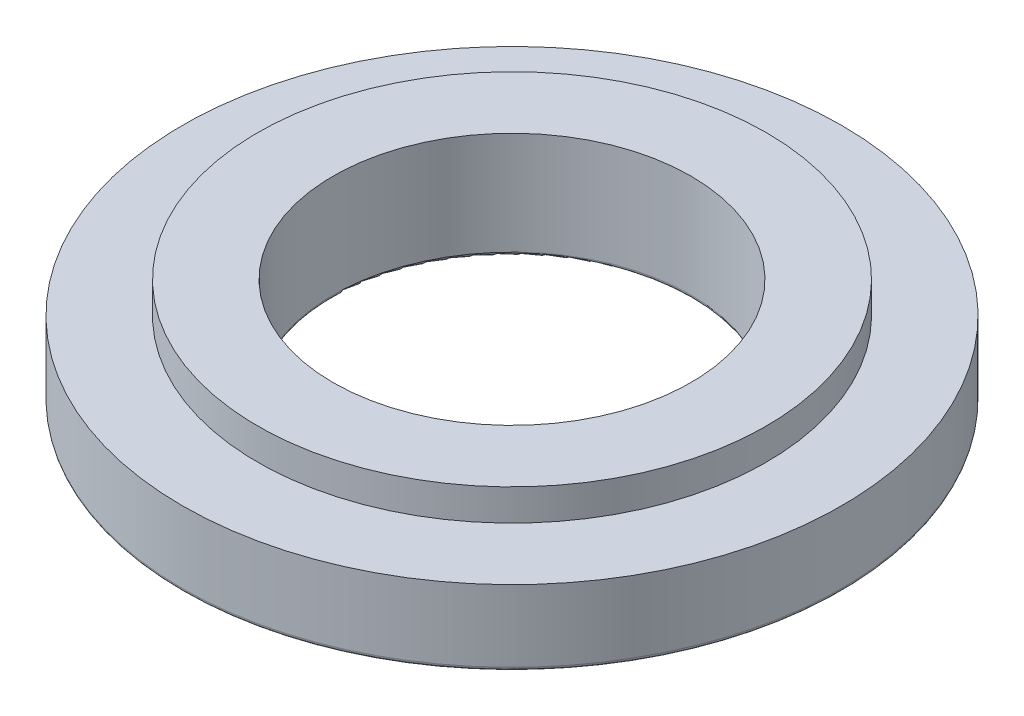
ISO-10303-21;
HEADER;
FILE_DESCRIPTION(('STEP AP214'),'2;1');
FILE_NAME('part.step','',(''),(''),'','','');
FILE_SCHEMA(('AUTOMOTIVE_DESIGN { 1 0 10303 214 1 1 1 1 }'));
ENDSEC;
DATA;
#1=APPLICATION_CONTEXT('core data for automotive mechanical design processes');
#2=APPLICATION_PROTOCOL_DEFINITION('international standard','automotive_design',2000,#1);
#3=PRODUCT_CONTEXT('',#1,'mechanical');
#4=PRODUCT('Part','Part','',(#3));
#5=PRODUCT_RELATED_PRODUCT_CATEGORY('part','',(#4));
#6=PRODUCT_DEFINITION_FORMATION('','',#4);
#7=PRODUCT_DEFINITION_CONTEXT('part definition',#1,'design');
#8=PRODUCT_DEFINITION('design','',#6,#7);
#9=PRODUCT_DEFINITION_SHAPE('','',#8);
#10=(LENGTH_UNIT() NAMED_UNIT(*) SI_UNIT(.MILLI.,.METRE.));
#11=(NAMED_UNIT(*) PLANE_ANGLE_UNIT() SI_UNIT($,.RADIAN.));
#12=(NAMED_UNIT(*) SI_UNIT($,.STERADIAN.) SOLID_ANGLE_UNIT());
#13=UNCERTAINTY_MEASURE_WITH_UNIT(LENGTH_MEASURE(1.E-05),#10,'distance_accuracy_value','');
#14=(GEOMETRIC_REPRESENTATION_CONTEXT(3) GLOBAL_UNCERTAINTY_ASSIGNED_CONTEXT((#13)) GLOBAL_UNIT_ASSIGNED_CONTEXT((#10,
#11,#12)) REPRESENTATION_CONTEXT('',''));
#15=CARTESIAN_POINT('',(0.,0.,0.));
#16=DIRECTION('',(0.,0.,1.));
#17=DIRECTION('',(1.,0.,0.));
#18=AXIS2_PLACEMENT_3D('',#15,#16,#17);
#19=CARTESIAN_POINT('',(13.125,0.,0.));
#20=DIRECTION('',(0.,-1.,0.));
#21=DIRECTION('',(0.,0.,-1.));
#22=AXIS2_PLACEMENT_3D('',#19,#20,#21);
#23=PLANE('',#22);
#24=CARTESIAN_POINT('',(0.,0.,0.));
#25=DIRECTION('',(0.,-1.,0.));
#26=DIRECTION('',(0.,0.,-1.));
#27=AXIS2_PLACEMENT_3D('',#24,#25,#26);
#28=CIRCLE('',#27,7.275);
#29=CARTESIAN_POINT('',(0.,0.,-7.275));
#30=VERTEX_POINT('',#29);
#31=EDGE_CURVE('E46',#30,#30,#28,.F.);
#32=ORIENTED_EDGE('',*,*,#31,.T.);
#33=EDGE_LOOP('',(#32));
#34=FACE_BOUND('',#33,.T.);
#35=CARTESIAN_POINT('',(0.,0.,0.));
#36=DIRECTION('',(0.,-1.,0.));
#37=DIRECTION('',(0.,0.,-1.));
#38=AXIS2_PLACEMENT_3D('',#35,#36,#37);
#39=CIRCLE('',#38,12.975);
#40=CARTESIAN_POINT('',(0.,0.,-12.975));
#41=VERTEX_POINT('',#40);
#42=EDGE_CURVE('E50',#41,#41,#39,.T.);
#43=ORIENTED_EDGE('',*,*,#42,.T.);
#44=EDGE_LOOP('',(#43));
#45=FACE_BOUND('',#44,.T.);
#46=ADVANCED_FACE('F39',(#34,#45),#23,.T.);
#47=CARTESIAN_POINT('',(0.,0.,0.));
#48=DIRECTION('',(0.,-1.,0.));
#49=DIRECTION('',(0.,0.,-1.));
#50=AXIS2_PLACEMENT_3D('',#47,#48,#49);
#51=CYLINDRICAL_SURFACE('',#50,7.125);
#52=CARTESIAN_POINT('',(0.,0.15,0.));
#53=DIRECTION('',(0.,-1.,0.));
#54=DIRECTION('',(0.,0.,-1.));
#55=AXIS2_PLACEMENT_3D('',#52,#53,#54);
#56=CIRCLE('',#55,7.125);
#57=CARTESIAN_POINT('',(0.,0.15,-7.125));
#58=VERTEX_POINT('',#57);
#59=EDGE_CURVE('E54',#58,#58,#56,.T.);
#60=ORIENTED_EDGE('',*,*,#59,.T.);
#61=EDGE_LOOP('',(#60));
#62=FACE_BOUND('',#61,.T.);
#63=CARTESIAN_POINT('',(0.,4.25,0.));
#64=DIRECTION('',(0.,-1.,0.));
#65=DIRECTION('',(0.,0.,-1.));
#66=AXIS2_PLACEMENT_3D('',#63,#64,#65);
#67=CIRCLE('',#66,7.125);
#68=CARTESIAN_POINT('',(0.,4.25,-7.125));
#69=VERTEX_POINT('',#68);
#70=EDGE_CURVE('E59',#69,#69,#67,.T.);
#71=ORIENTED_EDGE('',*,*,#70,.F.);
#72=EDGE_LOOP('',(#71));
#73=FACE_BOUND('',#72,.T.);
#74=ADVANCED_FACE('F89',(#62,#73),#51,.F.);
#75=CARTESIAN_POINT('',(7.125,4.25,0.));
#76=DIRECTION('',(0.,1.,0.));
#77=DIRECTION('',(0.,0.,1.));
#78=AXIS2_PLACEMENT_3D('',#75,#76,#77);
#79=PLANE('',#78);
#80=ORIENTED_EDGE('',*,*,#70,.T.);
#81=EDGE_LOOP('',(#80));
#82=FACE_BOUND('',#81,.T.);
#83=CARTESIAN_POINT('',(0.,4.25,0.));
#84=DIRECTION('',(0.,-1.,0.));
#85=DIRECTION('',(0.,0.,-1.));
#86=AXIS2_PLACEMENT_3D('',#83,#84,#85);
#87=CIRCLE('',#86,10.125);
#88=CARTESIAN_POINT('',(0.,4.25,-10.125));
#89=VERTEX_POINT('',#88);
#90=EDGE_CURVE('E62',#89,#89,#87,.T.);
#91=ORIENTED_EDGE('',*,*,#90,.F.);
#92=EDGE_LOOP('',(#91));
#93=FACE_BOUND('',#92,.T.);
#94=ADVANCED_FACE('F86',(#82,#93),#79,.T.);
#95=CARTESIAN_POINT('',(0.,0.,0.));
#96=DIRECTION('',(0.,-1.,0.));
#97=DIRECTION('',(0.,0.,-1.));
#98=AXIS2_PLACEMENT_3D('',#95,#96,#97);
#99=CYLINDRICAL_SURFACE('',#98,10.125);
#100=ORIENTED_EDGE('',*,*,#90,.T.);
#101=EDGE_LOOP('',(#100));
#102=FACE_BOUND('',#101,.T.);
#103=CARTESIAN_POINT('',(0.,3.,0.));
#104=DIRECTION('',(0.,-1.,0.));
#105=DIRECTION('',(0.,0.,-1.));
#106=AXIS2_PLACEMENT_3D('',#103,#104,#105);
#107=CIRCLE('',#106,10.125);
#108=CARTESIAN_POINT('',(0.,3.,-10.125));
#109=VERTEX_POINT('',#108);
#110=EDGE_CURVE('E65',#109,#109,#107,.T.);
#111=ORIENTED_EDGE('',*,*,#110,.F.);
#112=EDGE_LOOP('',(#111));
#113=FACE_BOUND('',#112,.T.);
#114=ADVANCED_FACE('F76',(#102,#113),#99,.T.);
#115=CARTESIAN_POINT('',(10.125,3.,0.));
#116=DIRECTION('',(0.,1.,0.));
#117=DIRECTION('',(0.,0.,1.));
#118=AXIS2_PLACEMENT_3D('',#115,#116,#117);
#119=PLANE('',#118);
#120=ORIENTED_EDGE('',*,*,#110,.T.);
#121=EDGE_LOOP('',(#120));
#122=FACE_BOUND('',#121,.T.);
#123=CARTESIAN_POINT('',(0.,3.,0.));
#124=DIRECTION('',(0.,-1.,0.));
#125=DIRECTION('',(0.,0.,-1.));
#126=AXIS2_PLACEMENT_3D('',#123,#124,#125);
#127=CIRCLE('',#126,13.125);
#128=CARTESIAN_POINT('',(0.,3.,-13.125));
#129=VERTEX_POINT('',#128);
#130=EDGE_CURVE('E68',#129,#129,#127,.T.);
#131=ORIENTED_EDGE('',*,*,#130,.F.);
#132=EDGE_LOOP('',(#131));
#133=FACE_BOUND('',#132,.T.);
#134=ADVANCED_FACE('F74',(#122,#133),#119,.T.);
#135=CARTESIAN_POINT('',(0.,0.,0.));
#136=DIRECTION('',(0.,-1.,0.));
#137=DIRECTION('',(0.,0.,-1.));
#138=AXIS2_PLACEMENT_3D('',#135,#136,#137);
#139=CYLINDRICAL_SURFACE('',#138,13.125);
#140=CARTESIAN_POINT('',(0.,0.15,0.));
#141=DIRECTION('',(0.,-1.,0.));
#142=DIRECTION('',(0.,0.,-1.));
#143=AXIS2_PLACEMENT_3D('',#140,#141,#142);
#144=CIRCLE('',#143,13.125);
#145=CARTESIAN_POINT('',(0.,0.15,-13.125));
#146=VERTEX_POINT('',#145);
#147=EDGE_CURVE('E10',#146,#146,#144,.F.);
#148=ORIENTED_EDGE('',*,*,#147,.T.);
#149=EDGE_LOOP('',(#148));
#150=FACE_BOUND('',#149,.T.);
#151=ORIENTED_EDGE('',*,*,#130,.T.);
#152=EDGE_LOOP('',(#151));
#153=FACE_BOUND('',#152,.T.);
#154=ADVANCED_FACE('F72',(#150,#153),#139,.T.);
#155=CARTESIAN_POINT('',(0.,0.15,0.));
#156=DIRECTION('',(0.,-1.,0.));
#157=DIRECTION('',(0.,0.,-1.));
#158=AXIS2_PLACEMENT_3D('',#155,#156,#157);
#159=TOROIDAL_SURFACE('',#158,7.275,0.15);
#160=ORIENTED_EDGE('',*,*,#31,.F.);
#161=EDGE_LOOP('',(#160));
#162=FACE_BOUND('',#161,.T.);
#163=ORIENTED_EDGE('',*,*,#59,.F.);
#164=EDGE_LOOP('',(#163));
#165=FACE_BOUND('',#164,.T.);
#166=ADVANCED_FACE('F84',(#162,#165),#159,.T.);
#167=CARTESIAN_POINT('',(0.,0.15,0.));
#168=DIRECTION('',(0.,-1.,0.));
#169=DIRECTION('',(0.,0.,-1.));
#170=AXIS2_PLACEMENT_3D('',#167,#168,#169);
#171=TOROIDAL_SURFACE('',#170,12.975,0.15);
#172=ORIENTED_EDGE('',*,*,#147,.F.);
#173=EDGE_LOOP('',(#172));
#174=FACE_BOUND('',#173,.T.);
#175=ORIENTED_EDGE('',*,*,#42,.F.);
#176=EDGE_LOOP('',(#175));
#177=FACE_BOUND('',#176,.T.);
#178=ADVANCED_FACE('F41',(#174,#177),#171,.T.);
#179=CLOSED_SHELL('',(#46,#74,#94,#114,#134,#154,#166,#178));
#180=MANIFOLD_SOLID_BREP('B2',#179);
#181=ADVANCED_BREP_SHAPE_REPRESENTATION('',(#18,#180),#14);
#182=SHAPE_DEFINITION_REPRESENTATION(#9,#181);
ENDSEC;
END-ISO-10303-21;
